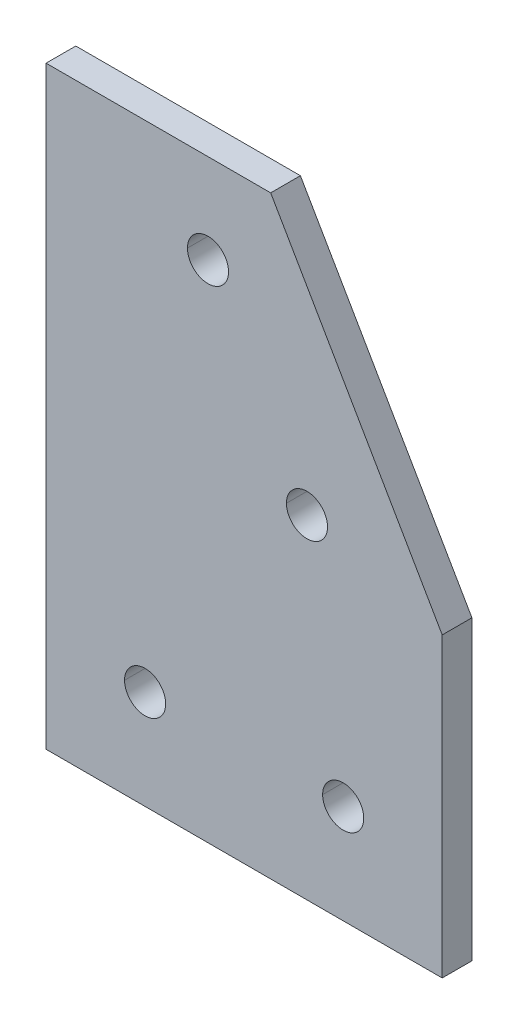
ISO-10303-21;
HEADER;
FILE_DESCRIPTION(('STEP AP214'),'2;1');
FILE_NAME('part.step','',(''),(''),'','','');
FILE_SCHEMA(('AUTOMOTIVE_DESIGN { 1 0 10303 214 1 1 1 1 }'));
ENDSEC;
DATA;
#1=APPLICATION_CONTEXT('core data for automotive mechanical design processes');
#2=APPLICATION_PROTOCOL_DEFINITION('international standard','automotive_design',2000,#1);
#3=PRODUCT_CONTEXT('',#1,'mechanical');
#4=PRODUCT('Part','Part','',(#3));
#5=PRODUCT_RELATED_PRODUCT_CATEGORY('part','',(#4));
#6=PRODUCT_DEFINITION_FORMATION('','',#4);
#7=PRODUCT_DEFINITION_CONTEXT('part definition',#1,'design');
#8=PRODUCT_DEFINITION('design','',#6,#7);
#9=PRODUCT_DEFINITION_SHAPE('','',#8);
#10=(LENGTH_UNIT() NAMED_UNIT(*) SI_UNIT(.MILLI.,.METRE.));
#11=(NAMED_UNIT(*) PLANE_ANGLE_UNIT() SI_UNIT($,.RADIAN.));
#12=(NAMED_UNIT(*) SI_UNIT($,.STERADIAN.) SOLID_ANGLE_UNIT());
#13=UNCERTAINTY_MEASURE_WITH_UNIT(LENGTH_MEASURE(1.E-05),#10,'distance_accuracy_value','');
#14=(GEOMETRIC_REPRESENTATION_CONTEXT(3) GLOBAL_UNCERTAINTY_ASSIGNED_CONTEXT((#13)) GLOBAL_UNIT_ASSIGNED_CONTEXT((#10,
#11,#12)) REPRESENTATION_CONTEXT('',''));
#15=CARTESIAN_POINT('',(0.,0.,0.));
#16=DIRECTION('',(0.,0.,1.));
#17=DIRECTION('',(1.,0.,0.));
#18=AXIS2_PLACEMENT_3D('',#15,#16,#17);
#19=CARTESIAN_POINT('',(-40.,60.,-3.));
#20=DIRECTION('',(0.,-1.,0.));
#21=DIRECTION('',(0.,0.,1.));
#22=AXIS2_PLACEMENT_3D('',#19,#20,#21);
#23=PLANE('',#22);
#24=DIRECTION('',(1.,0.,0.));
#25=VECTOR('',#24,1.);
#26=CARTESIAN_POINT('',(-40.,60.,3.));
#27=LINE('',#26,#25);
#28=CARTESIAN_POINT('',(-40.,60.,3.));
#29=VERTEX_POINT('',#28);
#30=CARTESIAN_POINT('',(5.35999999999999,60.,3.));
#31=VERTEX_POINT('',#30);
#32=EDGE_CURVE('E11',#29,#31,#27,.T.);
#33=ORIENTED_EDGE('',*,*,#32,.T.);
#34=DIRECTION('',(0.,0.,1.));
#35=VECTOR('',#34,1.);
#36=CARTESIAN_POINT('',(5.35999999999999,60.,-3.));
#37=LINE('',#36,#35);
#38=CARTESIAN_POINT('',(5.35999999999999,60.,-3.));
#39=VERTEX_POINT('',#38);
#40=EDGE_CURVE('E24',#39,#31,#37,.T.);
#41=ORIENTED_EDGE('',*,*,#40,.F.);
#42=DIRECTION('',(1.,0.,0.));
#43=VECTOR('',#42,1.);
#44=CARTESIAN_POINT('',(-40.,60.,-3.));
#45=LINE('',#44,#43);
#46=CARTESIAN_POINT('',(-40.,60.,-3.));
#47=VERTEX_POINT('',#46);
#48=EDGE_CURVE('E308',#47,#39,#45,.T.);
#49=ORIENTED_EDGE('',*,*,#48,.F.);
#50=DIRECTION('',(0.,0.,1.));
#51=VECTOR('',#50,1.);
#52=CARTESIAN_POINT('',(-40.,60.,-3.));
#53=LINE('',#52,#51);
#54=EDGE_CURVE('E304',#47,#29,#53,.T.);
#55=ORIENTED_EDGE('',*,*,#54,.T.);
#56=EDGE_LOOP('',(#33,#41,#49,#55));
#57=FACE_BOUND('',#56,.T.);
#58=ADVANCED_FACE('F16',(#57),#23,.F.);
#59=CARTESIAN_POINT('',(-40.,-60.,-3.));
#60=DIRECTION('',(1.,0.,0.));
#61=DIRECTION('',(0.,0.,-1.));
#62=AXIS2_PLACEMENT_3D('',#59,#60,#61);
#63=PLANE('',#62);
#64=DIRECTION('',(0.,1.,0.));
#65=VECTOR('',#64,1.);
#66=CARTESIAN_POINT('',(-40.,-60.,3.));
#67=LINE('',#66,#65);
#68=CARTESIAN_POINT('',(-40.,-60.,3.));
#69=VERTEX_POINT('',#68);
#70=EDGE_CURVE('E299',#69,#29,#67,.T.);
#71=ORIENTED_EDGE('',*,*,#70,.T.);
#72=ORIENTED_EDGE('',*,*,#54,.F.);
#73=DIRECTION('',(0.,1.,0.));
#74=VECTOR('',#73,1.);
#75=CARTESIAN_POINT('',(-40.,-60.,-3.));
#76=LINE('',#75,#74);
#77=CARTESIAN_POINT('',(-40.,-60.,-3.));
#78=VERTEX_POINT('',#77);
#79=EDGE_CURVE('E294',#78,#47,#76,.T.);
#80=ORIENTED_EDGE('',*,*,#79,.F.);
#81=DIRECTION('',(0.,0.,1.));
#82=VECTOR('',#81,1.);
#83=CARTESIAN_POINT('',(-40.,-60.,-3.));
#84=LINE('',#83,#82);
#85=EDGE_CURVE('E290',#78,#69,#84,.T.);
#86=ORIENTED_EDGE('',*,*,#85,.T.);
#87=EDGE_LOOP('',(#71,#72,#80,#86));
#88=FACE_BOUND('',#87,.T.);
#89=ADVANCED_FACE('F332',(#88),#63,.F.);
#90=CARTESIAN_POINT('',(40.,-60.,-3.));
#91=DIRECTION('',(0.,1.,0.));
#92=DIRECTION('',(0.,0.,-1.));
#93=AXIS2_PLACEMENT_3D('',#90,#91,#92);
#94=PLANE('',#93);
#95=DIRECTION('',(-1.,0.,0.));
#96=VECTOR('',#95,1.);
#97=CARTESIAN_POINT('',(40.,-60.,3.));
#98=LINE('',#97,#96);
#99=CARTESIAN_POINT('',(40.,-60.,3.));
#100=VERTEX_POINT('',#99);
#101=EDGE_CURVE('E285',#100,#69,#98,.T.);
#102=ORIENTED_EDGE('',*,*,#101,.T.);
#103=ORIENTED_EDGE('',*,*,#85,.F.);
#104=DIRECTION('',(-1.,0.,0.));
#105=VECTOR('',#104,1.);
#106=CARTESIAN_POINT('',(40.,-60.,-3.));
#107=LINE('',#106,#105);
#108=CARTESIAN_POINT('',(40.,-60.,-3.));
#109=VERTEX_POINT('',#108);
#110=EDGE_CURVE('E280',#109,#78,#107,.T.);
#111=ORIENTED_EDGE('',*,*,#110,.F.);
#112=DIRECTION('',(0.,0.,1.));
#113=VECTOR('',#112,1.);
#114=CARTESIAN_POINT('',(40.,-60.,-3.));
#115=LINE('',#114,#113);
#116=EDGE_CURVE('E276',#109,#100,#115,.T.);
#117=ORIENTED_EDGE('',*,*,#116,.T.);
#118=EDGE_LOOP('',(#102,#103,#111,#117));
#119=FACE_BOUND('',#118,.T.);
#120=ADVANCED_FACE('F335',(#119),#94,.F.);
#121=CARTESIAN_POINT('',(40.,0.,-3.));
#122=DIRECTION('',(-1.,0.,0.));
#123=DIRECTION('',(0.,0.,1.));
#124=AXIS2_PLACEMENT_3D('',#121,#122,#123);
#125=PLANE('',#124);
#126=DIRECTION('',(0.,-1.,0.));
#127=VECTOR('',#126,1.);
#128=CARTESIAN_POINT('',(40.,0.,3.));
#129=LINE('',#128,#127);
#130=CARTESIAN_POINT('',(40.,0.,3.));
#131=VERTEX_POINT('',#130);
#132=EDGE_CURVE('E271',#131,#100,#129,.T.);
#133=ORIENTED_EDGE('',*,*,#132,.T.);
#134=ORIENTED_EDGE('',*,*,#116,.F.);
#135=DIRECTION('',(0.,-1.,0.));
#136=VECTOR('',#135,1.);
#137=CARTESIAN_POINT('',(40.,0.,-3.));
#138=LINE('',#137,#136);
#139=CARTESIAN_POINT('',(40.,0.,-3.));
#140=VERTEX_POINT('',#139);
#141=EDGE_CURVE('E266',#140,#109,#138,.T.);
#142=ORIENTED_EDGE('',*,*,#141,.F.);
#143=DIRECTION('',(0.,0.,1.));
#144=VECTOR('',#143,1.);
#145=CARTESIAN_POINT('',(40.,0.,-3.));
#146=LINE('',#145,#144);
#147=EDGE_CURVE('E262',#140,#131,#146,.T.);
#148=ORIENTED_EDGE('',*,*,#147,.T.);
#149=EDGE_LOOP('',(#133,#134,#142,#148));
#150=FACE_BOUND('',#149,.T.);
#151=ADVANCED_FACE('F327',(#150),#125,.F.);
#152=CARTESIAN_POINT('',(5.36,60.,-3.));
#153=DIRECTION('',(-0.86603175470726,-0.499988999717658,0.));
#154=DIRECTION('',(-0.499988999717658,0.86603175470726,0.));
#155=AXIS2_PLACEMENT_3D('',#152,#153,#154);
#156=PLANE('',#155);
#157=DIRECTION('',(0.499988999717658,-0.86603175470726,0.));
#158=VECTOR('',#157,1.);
#159=CARTESIAN_POINT('',(5.36,60.,3.));
#160=LINE('',#159,#158);
#161=EDGE_CURVE('E257',#31,#131,#160,.T.);
#162=ORIENTED_EDGE('',*,*,#161,.T.);
#163=ORIENTED_EDGE('',*,*,#147,.F.);
#164=DIRECTION('',(0.499988999717658,-0.86603175470726,0.));
#165=VECTOR('',#164,1.);
#166=CARTESIAN_POINT('',(5.36,60.,-3.));
#167=LINE('',#166,#165);
#168=EDGE_CURVE('E252',#39,#140,#167,.T.);
#169=ORIENTED_EDGE('',*,*,#168,.F.);
#170=ORIENTED_EDGE('',*,*,#40,.T.);
#171=EDGE_LOOP('',(#162,#163,#169,#170));
#172=FACE_BOUND('',#171,.T.);
#173=ADVANCED_FACE('F319',(#172),#156,.F.);
#174=CARTESIAN_POINT('',(0.,-60.,-3.));
#175=DIRECTION('',(0.,0.,-1.));
#176=DIRECTION('',(-1.,0.,0.));
#177=AXIS2_PLACEMENT_3D('',#174,#175,#176);
#178=PLANE('',#177);
#179=CARTESIAN_POINT('',(20.,-40.,-3.));
#180=DIRECTION('',(0.,0.,-1.));
#181=DIRECTION('',(-1.,0.,0.));
#182=AXIS2_PLACEMENT_3D('',#179,#180,#181);
#183=CIRCLE('',#182,4.15);
#184=CARTESIAN_POINT('',(15.85,-40.,-3.));
#185=VERTEX_POINT('',#184);
#186=CARTESIAN_POINT('',(24.15,-40.,-3.));
#187=VERTEX_POINT('',#186);
#188=EDGE_CURVE('E247',#185,#187,#183,.T.);
#189=ORIENTED_EDGE('',*,*,#188,.F.);
#190=CARTESIAN_POINT('',(20.,-40.,-3.));
#191=DIRECTION('',(0.,0.,-1.));
#192=DIRECTION('',(-1.,0.,0.));
#193=AXIS2_PLACEMENT_3D('',#190,#191,#192);
#194=CIRCLE('',#193,4.15);
#195=EDGE_CURVE('E242',#187,#185,#194,.T.);
#196=ORIENTED_EDGE('',*,*,#195,.F.);
#197=EDGE_LOOP('',(#189,#196));
#198=FACE_BOUND('',#197,.T.);
#199=CARTESIAN_POINT('',(12.69,7.31000000000001,-3.));
#200=DIRECTION('',(0.,0.,-1.));
#201=DIRECTION('',(-1.,0.,0.));
#202=AXIS2_PLACEMENT_3D('',#199,#200,#201);
#203=CIRCLE('',#202,4.15);
#204=CARTESIAN_POINT('',(8.54,7.31000000000001,-3.));
#205=VERTEX_POINT('',#204);
#206=CARTESIAN_POINT('',(16.84,7.31000000000001,-3.));
#207=VERTEX_POINT('',#206);
#208=EDGE_CURVE('E237',#205,#207,#203,.T.);
#209=ORIENTED_EDGE('',*,*,#208,.F.);
#210=CARTESIAN_POINT('',(12.69,7.31000000000001,-3.));
#211=DIRECTION('',(0.,0.,-1.));
#212=DIRECTION('',(-1.,0.,0.));
#213=AXIS2_PLACEMENT_3D('',#210,#211,#212);
#214=CIRCLE('',#213,4.15);
#215=EDGE_CURVE('E232',#207,#205,#214,.T.);
#216=ORIENTED_EDGE('',*,*,#215,.F.);
#217=EDGE_LOOP('',(#209,#216));
#218=FACE_BOUND('',#217,.T.);
#219=CARTESIAN_POINT('',(-7.3,41.9336956433,-3.));
#220=DIRECTION('',(0.,0.,-1.));
#221=DIRECTION('',(-1.,0.,0.));
#222=AXIS2_PLACEMENT_3D('',#219,#220,#221);
#223=CIRCLE('',#222,4.15);
#224=CARTESIAN_POINT('',(-11.45,41.9336956433,-3.));
#225=VERTEX_POINT('',#224);
#226=CARTESIAN_POINT('',(-3.15,41.9336956433,-3.));
#227=VERTEX_POINT('',#226);
#228=EDGE_CURVE('E228',#225,#227,#223,.T.);
#229=ORIENTED_EDGE('',*,*,#228,.F.);
#230=CARTESIAN_POINT('',(-7.3,41.9336956433,-3.));
#231=DIRECTION('',(0.,0.,-1.));
#232=DIRECTION('',(-1.,0.,0.));
#233=AXIS2_PLACEMENT_3D('',#230,#231,#232);
#234=CIRCLE('',#233,4.15);
#235=EDGE_CURVE('E121',#227,#225,#234,.T.);
#236=ORIENTED_EDGE('',*,*,#235,.F.);
#237=EDGE_LOOP('',(#229,#236));
#238=FACE_BOUND('',#237,.T.);
#239=CARTESIAN_POINT('',(-20.,-40.,-3.));
#240=DIRECTION('',(0.,0.,-1.));
#241=DIRECTION('',(-1.,0.,0.));
#242=AXIS2_PLACEMENT_3D('',#239,#240,#241);
#243=CIRCLE('',#242,4.15);
#244=CARTESIAN_POINT('',(-24.15,-40.,-3.));
#245=VERTEX_POINT('',#244);
#246=CARTESIAN_POINT('',(-15.85,-40.,-3.));
#247=VERTEX_POINT('',#246);
#248=EDGE_CURVE('E221',#245,#247,#243,.T.);
#249=ORIENTED_EDGE('',*,*,#248,.F.);
#250=CARTESIAN_POINT('',(-20.,-40.,-3.));
#251=DIRECTION('',(0.,0.,-1.));
#252=DIRECTION('',(-1.,0.,0.));
#253=AXIS2_PLACEMENT_3D('',#250,#251,#252);
#254=CIRCLE('',#253,4.15);
#255=EDGE_CURVE('E217',#247,#245,#254,.T.);
#256=ORIENTED_EDGE('',*,*,#255,.F.);
#257=EDGE_LOOP('',(#249,#256));
#258=FACE_BOUND('',#257,.T.);
#259=ORIENTED_EDGE('',*,*,#168,.T.);
#260=ORIENTED_EDGE('',*,*,#141,.T.);
#261=ORIENTED_EDGE('',*,*,#110,.T.);
#262=ORIENTED_EDGE('',*,*,#79,.T.);
#263=ORIENTED_EDGE('',*,*,#48,.T.);
#264=EDGE_LOOP('',(#259,#260,#261,#262,#263));
#265=FACE_BOUND('',#264,.T.);
#266=ADVANCED_FACE('F329',(#198,#218,#238,#258,#265),#178,.T.);
#267=CARTESIAN_POINT('',(-20.,-40.,-3.));
#268=DIRECTION('',(0.,0.,-1.));
#269=DIRECTION('',(0.,1.,0.));
#270=AXIS2_PLACEMENT_3D('',#267,#268,#269);
#271=CYLINDRICAL_SURFACE('',#270,4.15);
#272=CARTESIAN_POINT('',(-20.,-40.,3.));
#273=DIRECTION('',(0.,0.,-1.));
#274=DIRECTION('',(-1.,0.,0.));
#275=AXIS2_PLACEMENT_3D('',#272,#273,#274);
#276=CIRCLE('',#275,4.15);
#277=CARTESIAN_POINT('',(-15.85,-40.,3.));
#278=VERTEX_POINT('',#277);
#279=CARTESIAN_POINT('',(-24.15,-40.,3.));
#280=VERTEX_POINT('',#279);
#281=EDGE_CURVE('E214',#278,#280,#276,.T.);
#282=ORIENTED_EDGE('',*,*,#281,.F.);
#283=CARTESIAN_POINT('',(-15.85,-40.,3.));
#284=DIRECTION('',(0.,0.,-1.));
#285=VECTOR('',#284,1.);
#286=LINE('',#283,#285);
#287=EDGE_CURVE('E191',#278,#247,#286,.T.);
#288=ORIENTED_EDGE('',*,*,#287,.T.);
#289=ORIENTED_EDGE('',*,*,#255,.T.);
#290=CARTESIAN_POINT('',(-24.15,-40.,3.));
#291=DIRECTION('',(0.,0.,-1.));
#292=VECTOR('',#291,1.);
#293=LINE('',#290,#292);
#294=EDGE_CURVE('E204',#280,#245,#293,.T.);
#295=ORIENTED_EDGE('',*,*,#294,.F.);
#296=EDGE_LOOP('',(#282,#288,#289,#295));
#297=FACE_BOUND('',#296,.T.);
#298=ADVANCED_FACE('F169',(#297),#271,.F.);
#299=CARTESIAN_POINT('',(-20.,-40.,-3.));
#300=DIRECTION('',(0.,0.,-1.));
#301=DIRECTION('',(0.,-1.,0.));
#302=AXIS2_PLACEMENT_3D('',#299,#300,#301);
#303=CYLINDRICAL_SURFACE('',#302,4.15);
#304=ORIENTED_EDGE('',*,*,#248,.T.);
#305=ORIENTED_EDGE('',*,*,#287,.F.);
#306=CARTESIAN_POINT('',(-20.,-40.,3.));
#307=DIRECTION('',(0.,0.,-1.));
#308=DIRECTION('',(-1.,0.,0.));
#309=AXIS2_PLACEMENT_3D('',#306,#307,#308);
#310=CIRCLE('',#309,4.15);
#311=EDGE_CURVE('E150',#280,#278,#310,.T.);
#312=ORIENTED_EDGE('',*,*,#311,.F.);
#313=ORIENTED_EDGE('',*,*,#294,.T.);
#314=EDGE_LOOP('',(#304,#305,#312,#313));
#315=FACE_BOUND('',#314,.T.);
#316=ADVANCED_FACE('F159',(#315),#303,.F.);
#317=CARTESIAN_POINT('',(0.,-60.,3.));
#318=DIRECTION('',(0.,0.,-1.));
#319=DIRECTION('',(-1.,0.,0.));
#320=AXIS2_PLACEMENT_3D('',#317,#318,#319);
#321=PLANE('',#320);
#322=CARTESIAN_POINT('',(20.,-40.,3.));
#323=DIRECTION('',(0.,0.,-1.));
#324=DIRECTION('',(-1.,0.,0.));
#325=AXIS2_PLACEMENT_3D('',#322,#323,#324);
#326=CIRCLE('',#325,4.15);
#327=CARTESIAN_POINT('',(15.85,-40.,3.));
#328=VERTEX_POINT('',#327);
#329=CARTESIAN_POINT('',(24.15,-40.,3.));
#330=VERTEX_POINT('',#329);
#331=EDGE_CURVE('E146',#328,#330,#326,.T.);
#332=ORIENTED_EDGE('',*,*,#331,.T.);
#333=CARTESIAN_POINT('',(20.,-40.,3.));
#334=DIRECTION('',(0.,0.,-1.));
#335=DIRECTION('',(-1.,0.,0.));
#336=AXIS2_PLACEMENT_3D('',#333,#334,#335);
#337=CIRCLE('',#336,4.15);
#338=EDGE_CURVE('E142',#330,#328,#337,.T.);
#339=ORIENTED_EDGE('',*,*,#338,.T.);
#340=EDGE_LOOP('',(#332,#339));
#341=FACE_BOUND('',#340,.T.);
#342=CARTESIAN_POINT('',(12.69,7.31000000000001,3.));
#343=DIRECTION('',(0.,0.,-1.));
#344=DIRECTION('',(-1.,0.,0.));
#345=AXIS2_PLACEMENT_3D('',#342,#343,#344);
#346=CIRCLE('',#345,4.15);
#347=CARTESIAN_POINT('',(8.54,7.31000000000001,3.));
#348=VERTEX_POINT('',#347);
#349=CARTESIAN_POINT('',(16.84,7.31000000000001,3.));
#350=VERTEX_POINT('',#349);
#351=EDGE_CURVE('E132',#348,#350,#346,.T.);
#352=ORIENTED_EDGE('',*,*,#351,.T.);
#353=CARTESIAN_POINT('',(12.69,7.31000000000001,3.));
#354=DIRECTION('',(0.,0.,-1.));
#355=DIRECTION('',(-1.,0.,0.));
#356=AXIS2_PLACEMENT_3D('',#353,#354,#355);
#357=CIRCLE('',#356,4.15);
#358=EDGE_CURVE('E130',#350,#348,#357,.T.);
#359=ORIENTED_EDGE('',*,*,#358,.T.);
#360=EDGE_LOOP('',(#352,#359));
#361=FACE_BOUND('',#360,.T.);
#362=CARTESIAN_POINT('',(-7.3,41.9336956433,3.));
#363=DIRECTION('',(0.,0.,-1.));
#364=DIRECTION('',(-1.,0.,0.));
#365=AXIS2_PLACEMENT_3D('',#362,#363,#364);
#366=CIRCLE('',#365,4.15);
#367=CARTESIAN_POINT('',(-11.45,41.9336956433,3.));
#368=VERTEX_POINT('',#367);
#369=CARTESIAN_POINT('',(-3.15,41.9336956433,3.));
#370=VERTEX_POINT('',#369);
#371=EDGE_CURVE('E110',#368,#370,#366,.T.);
#372=ORIENTED_EDGE('',*,*,#371,.T.);
#373=CARTESIAN_POINT('',(-7.3,41.9336956433,3.));
#374=DIRECTION('',(0.,0.,-1.));
#375=DIRECTION('',(-1.,0.,0.));
#376=AXIS2_PLACEMENT_3D('',#373,#374,#375);
#377=CIRCLE('',#376,4.15);
#378=EDGE_CURVE('E105',#370,#368,#377,.T.);
#379=ORIENTED_EDGE('',*,*,#378,.T.);
#380=EDGE_LOOP('',(#372,#379));
#381=FACE_BOUND('',#380,.T.);
#382=ORIENTED_EDGE('',*,*,#311,.T.);
#383=ORIENTED_EDGE('',*,*,#281,.T.);
#384=EDGE_LOOP('',(#382,#383));
#385=FACE_BOUND('',#384,.T.);
#386=ORIENTED_EDGE('',*,*,#161,.F.);
#387=ORIENTED_EDGE('',*,*,#32,.F.);
#388=ORIENTED_EDGE('',*,*,#70,.F.);
#389=ORIENTED_EDGE('',*,*,#101,.F.);
#390=ORIENTED_EDGE('',*,*,#132,.F.);
#391=EDGE_LOOP('',(#386,#387,#388,#389,#390));
#392=FACE_BOUND('',#391,.T.);
#393=ADVANCED_FACE('F107',(#341,#361,#381,#385,#392),#321,.F.);
#394=CARTESIAN_POINT('',(-7.3,41.9336956433,-3.));
#395=DIRECTION('',(0.,0.,-1.));
#396=DIRECTION('',(0.,1.,0.));
#397=AXIS2_PLACEMENT_3D('',#394,#395,#396);
#398=CYLINDRICAL_SURFACE('',#397,4.15);
#399=ORIENTED_EDGE('',*,*,#378,.F.);
#400=CARTESIAN_POINT('',(-3.15,41.9336956433,3.));
#401=DIRECTION('',(0.,0.,-1.));
#402=VECTOR('',#401,1.);
#403=LINE('',#400,#402);
#404=EDGE_CURVE('E114',#370,#227,#403,.T.);
#405=ORIENTED_EDGE('',*,*,#404,.T.);
#406=ORIENTED_EDGE('',*,*,#235,.T.);
#407=CARTESIAN_POINT('',(-11.45,41.9336956433,3.));
#408=DIRECTION('',(0.,0.,-1.));
#409=VECTOR('',#408,1.);
#410=LINE('',#407,#409);
#411=EDGE_CURVE('E118',#368,#225,#410,.T.);
#412=ORIENTED_EDGE('',*,*,#411,.F.);
#413=EDGE_LOOP('',(#399,#405,#406,#412));
#414=FACE_BOUND('',#413,.T.);
#415=ADVANCED_FACE('F120',(#414),#398,.F.);
#416=CARTESIAN_POINT('',(-7.3,41.9336956433,-3.));
#417=DIRECTION('',(0.,0.,-1.));
#418=DIRECTION('',(0.,-1.,0.));
#419=AXIS2_PLACEMENT_3D('',#416,#417,#418);
#420=CYLINDRICAL_SURFACE('',#419,4.15);
#421=ORIENTED_EDGE('',*,*,#228,.T.);
#422=ORIENTED_EDGE('',*,*,#404,.F.);
#423=ORIENTED_EDGE('',*,*,#371,.F.);
#424=ORIENTED_EDGE('',*,*,#411,.T.);
#425=EDGE_LOOP('',(#421,#422,#423,#424));
#426=FACE_BOUND('',#425,.T.);
#427=ADVANCED_FACE('F128',(#426),#420,.F.);
#428=CARTESIAN_POINT('',(12.69,7.31000000000001,-3.));
#429=DIRECTION('',(0.,0.,-1.));
#430=DIRECTION('',(0.,1.,0.));
#431=AXIS2_PLACEMENT_3D('',#428,#429,#430);
#432=CYLINDRICAL_SURFACE('',#431,4.15);
#433=ORIENTED_EDGE('',*,*,#358,.F.);
#434=CARTESIAN_POINT('',(16.84,7.31000000000001,3.));
#435=DIRECTION('',(0.,0.,-1.));
#436=VECTOR('',#435,1.);
#437=LINE('',#434,#436);
#438=EDGE_CURVE('E125',#350,#207,#437,.T.);
#439=ORIENTED_EDGE('',*,*,#438,.T.);
#440=ORIENTED_EDGE('',*,*,#215,.T.);
#441=CARTESIAN_POINT('',(8.54,7.31000000000001,3.));
#442=DIRECTION('',(0.,0.,-1.));
#443=VECTOR('',#442,1.);
#444=LINE('',#441,#443);
#445=EDGE_CURVE('E569',#348,#205,#444,.T.);
#446=ORIENTED_EDGE('',*,*,#445,.F.);
#447=EDGE_LOOP('',(#433,#439,#440,#446));
#448=FACE_BOUND('',#447,.T.);
#449=ADVANCED_FACE('F435',(#448),#432,.F.);
#450=CARTESIAN_POINT('',(12.69,7.31000000000001,-3.));
#451=DIRECTION('',(0.,0.,-1.));
#452=DIRECTION('',(0.,-1.,0.));
#453=AXIS2_PLACEMENT_3D('',#450,#451,#452);
#454=CYLINDRICAL_SURFACE('',#453,4.15);
#455=ORIENTED_EDGE('',*,*,#208,.T.);
#456=ORIENTED_EDGE('',*,*,#438,.F.);
#457=ORIENTED_EDGE('',*,*,#351,.F.);
#458=ORIENTED_EDGE('',*,*,#445,.T.);
#459=EDGE_LOOP('',(#455,#456,#457,#458));
#460=FACE_BOUND('',#459,.T.);
#461=ADVANCED_FACE('F445',(#460),#454,.F.);
#462=CARTESIAN_POINT('',(20.,-40.,-3.));
#463=DIRECTION('',(0.,0.,-1.));
#464=DIRECTION('',(0.,1.,0.));
#465=AXIS2_PLACEMENT_3D('',#462,#463,#464);
#466=CYLINDRICAL_SURFACE('',#465,4.15);
#467=ORIENTED_EDGE('',*,*,#338,.F.);
#468=CARTESIAN_POINT('',(24.15,-40.,3.));
#469=DIRECTION('',(0.,0.,-1.));
#470=VECTOR('',#469,1.);
#471=LINE('',#468,#470);
#472=EDGE_CURVE('E567',#330,#187,#471,.T.);
#473=ORIENTED_EDGE('',*,*,#472,.T.);
#474=ORIENTED_EDGE('',*,*,#195,.T.);
#475=CARTESIAN_POINT('',(15.85,-40.,3.));
#476=DIRECTION('',(0.,0.,-1.));
#477=VECTOR('',#476,1.);
#478=LINE('',#475,#477);
#479=EDGE_CURVE('E563',#328,#185,#478,.T.);
#480=ORIENTED_EDGE('',*,*,#479,.F.);
#481=EDGE_LOOP('',(#467,#473,#474,#480));
#482=FACE_BOUND('',#481,.T.);
#483=ADVANCED_FACE('F456',(#482),#466,.F.);
#484=CARTESIAN_POINT('',(20.,-40.,-3.));
#485=DIRECTION('',(0.,0.,-1.));
#486=DIRECTION('',(0.,-1.,0.));
#487=AXIS2_PLACEMENT_3D('',#484,#485,#486);
#488=CYLINDRICAL_SURFACE('',#487,4.15);
#489=ORIENTED_EDGE('',*,*,#188,.T.);
#490=ORIENTED_EDGE('',*,*,#472,.F.);
#491=ORIENTED_EDGE('',*,*,#331,.F.);
#492=ORIENTED_EDGE('',*,*,#479,.T.);
#493=EDGE_LOOP('',(#489,#490,#491,#492));
#494=FACE_BOUND('',#493,.T.);
#495=ADVANCED_FACE('F356',(#494),#488,.F.);
#496=CLOSED_SHELL('',(#58,#89,#120,#151,#173,#266,#298,#316,#393,#415,#427,#449,#461,#483,#495));
#497=MANIFOLD_SOLID_BREP('B1',#496);
#498=ADVANCED_BREP_SHAPE_REPRESENTATION('',(#18,#497),#14);
#499=SHAPE_DEFINITION_REPRESENTATION(#9,#498);
ENDSEC;
END-ISO-10303-21;
